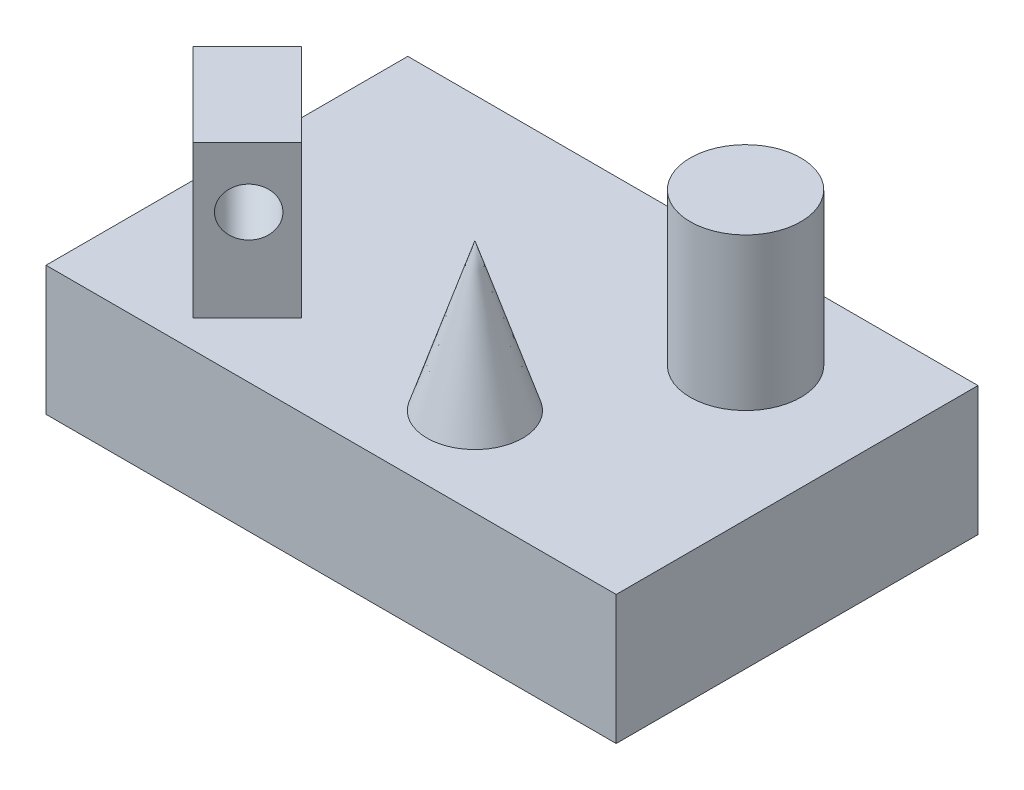
ISO-10303-21;
HEADER;
FILE_DESCRIPTION(('STEP AP214'),'2;1');
FILE_NAME('part.step','',(''),(''),'','','');
FILE_SCHEMA(('AUTOMOTIVE_DESIGN { 1 0 10303 214 1 1 1 1 }'));
ENDSEC;
DATA;
#1=APPLICATION_CONTEXT('core data for automotive mechanical design processes');
#2=APPLICATION_PROTOCOL_DEFINITION('international standard','automotive_design',2000,#1);
#3=PRODUCT_CONTEXT('',#1,'mechanical');
#4=PRODUCT('Part','Part','',(#3));
#5=PRODUCT_RELATED_PRODUCT_CATEGORY('part','',(#4));
#6=PRODUCT_DEFINITION_FORMATION('','',#4);
#7=PRODUCT_DEFINITION_CONTEXT('part definition',#1,'design');
#8=PRODUCT_DEFINITION('design','',#6,#7);
#9=PRODUCT_DEFINITION_SHAPE('','',#8);
#10=(LENGTH_UNIT() NAMED_UNIT(*) SI_UNIT(.MILLI.,.METRE.));
#11=(NAMED_UNIT(*) PLANE_ANGLE_UNIT() SI_UNIT($,.RADIAN.));
#12=(NAMED_UNIT(*) SI_UNIT($,.STERADIAN.) SOLID_ANGLE_UNIT());
#13=UNCERTAINTY_MEASURE_WITH_UNIT(LENGTH_MEASURE(1.E-05),#10,'distance_accuracy_value','');
#14=(GEOMETRIC_REPRESENTATION_CONTEXT(3) GLOBAL_UNCERTAINTY_ASSIGNED_CONTEXT((#13)) GLOBAL_UNIT_ASSIGNED_CONTEXT((#10,
#11,#12)) REPRESENTATION_CONTEXT('',''));
#15=CARTESIAN_POINT('',(0.,0.,0.));
#16=DIRECTION('',(0.,0.,1.));
#17=DIRECTION('',(1.,0.,0.));
#18=AXIS2_PLACEMENT_3D('',#15,#16,#17);
#19=CARTESIAN_POINT('',(33.5593300792751,12.7353157288854,-8.7390266420105));
#20=DIRECTION('',(0.,-1.,0.));
#21=DIRECTION('',(0.,0.,1.));
#22=AXIS2_PLACEMENT_3D('',#19,#20,#21);
#23=CONICAL_SURFACE('',#22,4.71714189217371,0.314159265358979);
#24=CARTESIAN_POINT('',(33.5593300792751,27.2531856729481,-8.7390266420105));
#25=VERTEX_POINT('',#24);
#26=VERTEX_LOOP('',#25);
#27=FACE_BOUND('',#26,.T.);
#28=CARTESIAN_POINT('',(33.5593300792751,12.7353157288854,-8.7390266420105));
#29=DIRECTION('',(0.,1.,0.));
#30=DIRECTION('',(0.,0.,1.));
#31=AXIS2_PLACEMENT_3D('',#28,#29,#30);
#32=CIRCLE('',#31,4.71714189217371);
#33=CARTESIAN_POINT('',(33.5593300792751,12.7353157288854,-4.02188474983679));
#34=VERTEX_POINT('',#33);
#35=EDGE_CURVE('E12',#34,#34,#32,.T.);
#36=ORIENTED_EDGE('',*,*,#35,.T.);
#37=EDGE_LOOP('',(#36));
#38=FACE_BOUND('',#37,.T.);
#39=ADVANCED_FACE('F48',(#27,#38),#23,.T.);
#40=CARTESIAN_POINT('',(33.5593300792751,12.7353157288854,-8.7390266420105));
#41=DIRECTION('',(0.,1.,0.));
#42=DIRECTION('',(0.,0.,1.));
#43=AXIS2_PLACEMENT_3D('',#40,#41,#42);
#44=PLANE('',#43);
#45=ORIENTED_EDGE('',*,*,#35,.F.);
#46=EDGE_LOOP('',(#45));
#47=FACE_BOUND('',#46,.T.);
#48=ADVANCED_FACE('F57',(#47),#44,.F.);
#49=CLOSED_SHELL('',(#39,#48));
#50=MANIFOLD_SOLID_BREP('B2',#49);
#51=CARTESIAN_POINT('',(43.0515985534843,27.7353157288854,-25.9367836423426));
#52=DIRECTION('',(0.,-1.,0.));
#53=DIRECTION('',(0.,0.,-1.));
#54=AXIS2_PLACEMENT_3D('',#51,#52,#53);
#55=CYLINDRICAL_SURFACE('',#54,5.45375066617644);
#56=CARTESIAN_POINT('',(43.0515985534843,27.7353157288854,-25.9367836423426));
#57=DIRECTION('',(0.,1.,0.));
#58=DIRECTION('',(0.,0.,1.));
#59=AXIS2_PLACEMENT_3D('',#56,#57,#58);
#60=CIRCLE('',#59,5.45375066617644);
#61=CARTESIAN_POINT('',(43.0515985534843,27.7353157288854,-20.4830329761661));
#62=VERTEX_POINT('',#61);
#63=EDGE_CURVE('E47',#62,#62,#60,.T.);
#64=ORIENTED_EDGE('',*,*,#63,.F.);
#65=EDGE_LOOP('',(#64));
#66=FACE_BOUND('',#65,.T.);
#67=CARTESIAN_POINT('',(43.0515985534843,12.7353157288854,-25.9367836423426));
#68=DIRECTION('',(0.,1.,0.));
#69=DIRECTION('',(0.,0.,1.));
#70=AXIS2_PLACEMENT_3D('',#67,#68,#69);
#71=CIRCLE('',#70,5.45375066617644);
#72=CARTESIAN_POINT('',(43.0515985534843,12.7353157288854,-20.4830329761661));
#73=VERTEX_POINT('',#72);
#74=EDGE_CURVE('E89',#73,#73,#71,.T.);
#75=ORIENTED_EDGE('',*,*,#74,.T.);
#76=EDGE_LOOP('',(#75));
#77=FACE_BOUND('',#76,.T.);
#78=ADVANCED_FACE('F86',(#66,#77),#55,.T.);
#79=CARTESIAN_POINT('',(43.0515985534843,27.7353157288854,-25.9367836423426));
#80=DIRECTION('',(0.,1.,0.));
#81=DIRECTION('',(0.,0.,1.));
#82=AXIS2_PLACEMENT_3D('',#79,#80,#81);
#83=PLANE('',#82);
#84=ORIENTED_EDGE('',*,*,#63,.T.);
#85=EDGE_LOOP('',(#84));
#86=FACE_BOUND('',#85,.T.);
#87=ADVANCED_FACE('F101',(#86),#83,.T.);
#88=CARTESIAN_POINT('',(43.0515985534843,12.7353157288854,-25.9367836423426));
#89=DIRECTION('',(0.,1.,0.));
#90=DIRECTION('',(0.,0.,1.));
#91=AXIS2_PLACEMENT_3D('',#88,#89,#90);
#92=PLANE('',#91);
#93=ORIENTED_EDGE('',*,*,#74,.F.);
#94=EDGE_LOOP('',(#93));
#95=FACE_BOUND('',#94,.T.);
#96=ADVANCED_FACE('F99',(#95),#92,.F.);
#97=CLOSED_SHELL('',(#78,#87,#96));
#98=MANIFOLD_SOLID_BREP('B6',#97);
#99=CARTESIAN_POINT('',(11.7593853706369,27.7353157288854,-2.75530498030886));
#100=DIRECTION('',(0.707106781186546,0.,-0.707106781186549));
#101=DIRECTION('',(-0.707106781186549,0.,-0.707106781186546));
#102=AXIS2_PLACEMENT_3D('',#99,#100,#101);
#103=PLANE('',#102);
#104=DIRECTION('',(0.707106781186549,0.,0.707106781186546));
#105=VECTOR('',#104,1.);
#106=CARTESIAN_POINT('',(11.7593853706369,12.7353157288854,-2.75530498030886));
#107=LINE('',#106,#105);
#108=CARTESIAN_POINT('',(3.57256399058611,12.7353157288854,-10.9421263603596));
#109=VERTEX_POINT('',#108);
#110=CARTESIAN_POINT('',(11.7593853706369,12.7353157288854,-2.75530498030886));
#111=VERTEX_POINT('',#110);
#112=EDGE_CURVE('E201',#109,#111,#107,.T.);
#113=ORIENTED_EDGE('',*,*,#112,.T.);
#114=DIRECTION('',(0.,-1.,0.));
#115=VECTOR('',#114,1.);
#116=CARTESIAN_POINT('',(11.7593853706369,27.7353157288854,-2.75530498030886));
#117=LINE('',#116,#115);
#118=CARTESIAN_POINT('',(11.7593853706369,27.7353157288854,-2.75530498030886));
#119=VERTEX_POINT('',#118);
#120=EDGE_CURVE('E84',#119,#111,#117,.T.);
#121=ORIENTED_EDGE('',*,*,#120,.F.);
#122=DIRECTION('',(0.707106781186549,0.,0.707106781186546));
#123=VECTOR('',#122,1.);
#124=CARTESIAN_POINT('',(11.7593853706369,27.7353157288854,-2.75530498030886));
#125=LINE('',#124,#123);
#126=CARTESIAN_POINT('',(3.57256399058611,27.7353157288854,-10.9421263603596));
#127=VERTEX_POINT('',#126);
#128=EDGE_CURVE('E188',#127,#119,#125,.T.);
#129=ORIENTED_EDGE('',*,*,#128,.F.);
#130=DIRECTION('',(0.,-1.,0.));
#131=VECTOR('',#130,1.);
#132=CARTESIAN_POINT('',(3.57256399058611,27.7353157288854,-10.9421263603596));
#133=LINE('',#132,#131);
#134=EDGE_CURVE('E197',#127,#109,#133,.T.);
#135=ORIENTED_EDGE('',*,*,#134,.T.);
#136=EDGE_LOOP('',(#113,#121,#129,#135));
#137=FACE_BOUND('',#136,.T.);
#138=ADVANCED_FACE('F136',(#137),#103,.F.);
#139=CARTESIAN_POINT('',(17.1091894407691,27.7353157288854,-8.10510905044106));
#140=DIRECTION('',(-0.707106781186549,0.,-0.707106781186546));
#141=DIRECTION('',(-0.707106781186546,0.,0.707106781186549));
#142=AXIS2_PLACEMENT_3D('',#139,#140,#141);
#143=PLANE('',#142);
#144=CARTESIAN_POINT('',(14.4970043060488,21.7763026803264,-5.49292391572073));
#145=DIRECTION('',(-0.707106781186549,0.,-0.707106781186546));
#146=DIRECTION('',(-0.707106781186546,0.,0.707106781186549));
#147=AXIS2_PLACEMENT_3D('',#144,#145,#146);
#148=CIRCLE('',#147,2.3887119439335);
#149=CARTESIAN_POINT('',(12.8079298921921,21.7763026803264,-3.80384950186405));
#150=VERTEX_POINT('',#149);
#151=EDGE_CURVE('E204',#150,#150,#148,.T.);
#152=ORIENTED_EDGE('',*,*,#151,.T.);
#153=EDGE_LOOP('',(#152));
#154=FACE_BOUND('',#153,.T.);
#155=DIRECTION('',(0.707106781186546,0.,-0.707106781186549));
#156=VECTOR('',#155,1.);
#157=CARTESIAN_POINT('',(17.1091894407691,12.7353157288854,-8.10510905044106));
#158=LINE('',#157,#156);
#159=CARTESIAN_POINT('',(17.1091894407691,12.7353157288854,-8.10510905044106));
#160=VERTEX_POINT('',#159);
#161=EDGE_CURVE('E192',#111,#160,#158,.T.);
#162=ORIENTED_EDGE('',*,*,#161,.T.);
#163=DIRECTION('',(0.,-1.,0.));
#164=VECTOR('',#163,1.);
#165=CARTESIAN_POINT('',(17.1091894407691,27.7353157288854,-8.10510905044106));
#166=LINE('',#165,#164);
#167=CARTESIAN_POINT('',(17.1091894407691,27.7353157288854,-8.10510905044106));
#168=VERTEX_POINT('',#167);
#169=EDGE_CURVE('E145',#168,#160,#166,.T.);
#170=ORIENTED_EDGE('',*,*,#169,.F.);
#171=DIRECTION('',(0.707106781186546,0.,-0.707106781186549));
#172=VECTOR('',#171,1.);
#173=CARTESIAN_POINT('',(17.1091894407691,27.7353157288854,-8.10510905044106));
#174=LINE('',#173,#172);
#175=EDGE_CURVE('E183',#119,#168,#174,.T.);
#176=ORIENTED_EDGE('',*,*,#175,.F.);
#177=ORIENTED_EDGE('',*,*,#120,.T.);
#178=EDGE_LOOP('',(#162,#170,#176,#177));
#179=FACE_BOUND('',#178,.T.);
#180=ADVANCED_FACE('F191',(#154,#179),#143,.F.);
#181=CARTESIAN_POINT('',(8.9223680607183,27.7353157288854,-16.2919304304918));
#182=DIRECTION('',(-0.707106781186546,0.,0.707106781186549));
#183=DIRECTION('',(0.707106781186549,0.,0.707106781186546));
#184=AXIS2_PLACEMENT_3D('',#181,#182,#183);
#185=PLANE('',#184);
#186=DIRECTION('',(-0.707106781186549,0.,-0.707106781186546));
#187=VECTOR('',#186,1.);
#188=CARTESIAN_POINT('',(8.9223680607183,12.7353157288854,-16.2919304304918));
#189=LINE('',#188,#187);
#190=CARTESIAN_POINT('',(8.9223680607183,12.7353157288854,-16.2919304304918));
#191=VERTEX_POINT('',#190);
#192=EDGE_CURVE('E170',#160,#191,#189,.T.);
#193=ORIENTED_EDGE('',*,*,#192,.T.);
#194=DIRECTION('',(0.,-1.,0.));
#195=VECTOR('',#194,1.);
#196=CARTESIAN_POINT('',(8.9223680607183,27.7353157288854,-16.2919304304918));
#197=LINE('',#196,#195);
#198=CARTESIAN_POINT('',(8.9223680607183,27.7353157288854,-16.2919304304918));
#199=VERTEX_POINT('',#198);
#200=EDGE_CURVE('E193',#199,#191,#197,.T.);
#201=ORIENTED_EDGE('',*,*,#200,.F.);
#202=DIRECTION('',(-0.707106781186549,0.,-0.707106781186546));
#203=VECTOR('',#202,1.);
#204=CARTESIAN_POINT('',(8.9223680607183,27.7353157288854,-16.2919304304918));
#205=LINE('',#204,#203);
#206=EDGE_CURVE('E186',#168,#199,#205,.T.);
#207=ORIENTED_EDGE('',*,*,#206,.F.);
#208=ORIENTED_EDGE('',*,*,#169,.T.);
#209=EDGE_LOOP('',(#193,#201,#207,#208));
#210=FACE_BOUND('',#209,.T.);
#211=ADVANCED_FACE('F195',(#210),#185,.F.);
#212=CARTESIAN_POINT('',(3.57256399058611,27.7353157288854,-10.9421263603596));
#213=DIRECTION('',(0.707106781186549,0.,0.707106781186546));
#214=DIRECTION('',(0.707106781186546,0.,-0.707106781186549));
#215=AXIS2_PLACEMENT_3D('',#212,#213,#214);
#216=PLANE('',#215);
#217=CARTESIAN_POINT('',(6.31018292599797,21.7763026803264,-13.6797452957715));
#218=DIRECTION('',(0.707106781186549,0.,0.707106781186546));
#219=DIRECTION('',(0.707106781186546,0.,-0.707106781186549));
#220=AXIS2_PLACEMENT_3D('',#217,#218,#219);
#221=CIRCLE('',#220,2.3887119439335);
#222=CARTESIAN_POINT('',(7.99925733985464,21.7763026803264,-15.3688197096282));
#223=VERTEX_POINT('',#222);
#224=EDGE_CURVE('E139',#223,#223,#221,.T.);
#225=ORIENTED_EDGE('',*,*,#224,.T.);
#226=EDGE_LOOP('',(#225));
#227=FACE_BOUND('',#226,.T.);
#228=DIRECTION('',(-0.707106781186546,0.,0.707106781186549));
#229=VECTOR('',#228,1.);
#230=CARTESIAN_POINT('',(3.57256399058611,12.7353157288854,-10.9421263603596));
#231=LINE('',#230,#229);
#232=EDGE_CURVE('E176',#191,#109,#231,.T.);
#233=ORIENTED_EDGE('',*,*,#232,.T.);
#234=ORIENTED_EDGE('',*,*,#134,.F.);
#235=DIRECTION('',(-0.707106781186546,0.,0.707106781186549));
#236=VECTOR('',#235,1.);
#237=CARTESIAN_POINT('',(3.57256399058611,27.7353157288854,-10.9421263603596));
#238=LINE('',#237,#236);
#239=EDGE_CURVE('E153',#199,#127,#238,.T.);
#240=ORIENTED_EDGE('',*,*,#239,.F.);
#241=ORIENTED_EDGE('',*,*,#200,.T.);
#242=EDGE_LOOP('',(#233,#234,#240,#241));
#243=FACE_BOUND('',#242,.T.);
#244=ADVANCED_FACE('F209',(#227,#243),#216,.F.);
#245=CARTESIAN_POINT('',(0.,27.7353157288854,0.));
#246=DIRECTION('',(0.,-1.,0.));
#247=DIRECTION('',(0.,0.,-1.));
#248=AXIS2_PLACEMENT_3D('',#245,#246,#247);
#249=PLANE('',#248);
#250=ORIENTED_EDGE('',*,*,#128,.T.);
#251=ORIENTED_EDGE('',*,*,#175,.T.);
#252=ORIENTED_EDGE('',*,*,#206,.T.);
#253=ORIENTED_EDGE('',*,*,#239,.T.);
#254=EDGE_LOOP('',(#250,#251,#252,#253));
#255=FACE_BOUND('',#254,.T.);
#256=ADVANCED_FACE('F184',(#255),#249,.F.);
#257=CARTESIAN_POINT('',(0.,12.7353157288854,0.));
#258=DIRECTION('',(0.,-1.,0.));
#259=DIRECTION('',(0.,0.,-1.));
#260=AXIS2_PLACEMENT_3D('',#257,#258,#259);
#261=PLANE('',#260);
#262=ORIENTED_EDGE('',*,*,#112,.F.);
#263=ORIENTED_EDGE('',*,*,#232,.F.);
#264=ORIENTED_EDGE('',*,*,#192,.F.);
#265=ORIENTED_EDGE('',*,*,#161,.F.);
#266=EDGE_LOOP('',(#262,#263,#264,#265));
#267=FACE_BOUND('',#266,.T.);
#268=ADVANCED_FACE('F212',(#267),#261,.T.);
#269=CARTESIAN_POINT('',(-7.84547289169112,21.7763026803264,-27.8354011134606));
#270=DIRECTION('',(0.707106781186549,0.,0.707106781186546));
#271=DIRECTION('',(0.707106781186546,0.,-0.707106781186549));
#272=AXIS2_PLACEMENT_3D('',#269,#270,#271);
#273=CYLINDRICAL_SURFACE('',#272,2.3887119439335);
#274=ORIENTED_EDGE('',*,*,#224,.F.);
#275=EDGE_LOOP('',(#274));
#276=FACE_BOUND('',#275,.T.);
#277=ORIENTED_EDGE('',*,*,#151,.F.);
#278=EDGE_LOOP('',(#277));
#279=FACE_BOUND('',#278,.T.);
#280=ADVANCED_FACE('F222',(#276,#279),#273,.F.);
#281=CLOSED_SHELL('',(#138,#180,#211,#244,#256,#268,#280));
#282=MANIFOLD_SOLID_BREP('B42',#281);
#283=CARTESIAN_POINT('',(0.,12.7353157288854,0.));
#284=DIRECTION('',(1.,0.,0.));
#285=DIRECTION('',(0.,0.,-1.));
#286=AXIS2_PLACEMENT_3D('',#283,#284,#285);
#287=PLANE('',#286);
#288=DIRECTION('',(0.,0.,1.));
#289=VECTOR('',#288,1.);
#290=CARTESIAN_POINT('',(0.,0.,0.));
#291=LINE('',#290,#289);
#292=CARTESIAN_POINT('',(0.,0.,-35.6808740051517));
#293=VERTEX_POINT('',#292);
#294=CARTESIAN_POINT('',(0.,0.,0.));
#295=VERTEX_POINT('',#294);
#296=EDGE_CURVE('E344',#293,#295,#291,.T.);
#297=ORIENTED_EDGE('',*,*,#296,.T.);
#298=DIRECTION('',(0.,-1.,0.));
#299=VECTOR('',#298,1.);
#300=CARTESIAN_POINT('',(0.,12.7353157288854,0.));
#301=LINE('',#300,#299);
#302=CARTESIAN_POINT('',(0.,12.7353157288854,0.));
#303=VERTEX_POINT('',#302);
#304=EDGE_CURVE('E134',#303,#295,#301,.T.);
#305=ORIENTED_EDGE('',*,*,#304,.F.);
#306=DIRECTION('',(0.,0.,1.));
#307=VECTOR('',#306,1.);
#308=CARTESIAN_POINT('',(0.,12.7353157288854,0.));
#309=LINE('',#308,#307);
#310=CARTESIAN_POINT('',(0.,12.7353157288854,-35.6808740051517));
#311=VERTEX_POINT('',#310);
#312=EDGE_CURVE('E332',#311,#303,#309,.T.);
#313=ORIENTED_EDGE('',*,*,#312,.F.);
#314=DIRECTION('',(0.,-1.,0.));
#315=VECTOR('',#314,1.);
#316=CARTESIAN_POINT('',(0.,12.7353157288854,-35.6808740051517));
#317=LINE('',#316,#315);
#318=EDGE_CURVE('E340',#311,#293,#317,.T.);
#319=ORIENTED_EDGE('',*,*,#318,.T.);
#320=EDGE_LOOP('',(#297,#305,#313,#319));
#321=FACE_BOUND('',#320,.T.);
#322=ADVANCED_FACE('F281',(#321),#287,.F.);
#323=CARTESIAN_POINT('',(0.,12.7353157288854,0.));
#324=DIRECTION('',(0.,0.,-1.));
#325=DIRECTION('',(-1.,0.,0.));
#326=AXIS2_PLACEMENT_3D('',#323,#324,#325);
#327=PLANE('',#326);
#328=DIRECTION('',(1.,0.,0.));
#329=VECTOR('',#328,1.);
#330=CARTESIAN_POINT('',(0.,0.,0.));
#331=LINE('',#330,#329);
#332=CARTESIAN_POINT('',(56.2304698498983,0.,0.));
#333=VERTEX_POINT('',#332);
#334=EDGE_CURVE('E336',#295,#333,#331,.T.);
#335=ORIENTED_EDGE('',*,*,#334,.T.);
#336=DIRECTION('',(0.,-1.,0.));
#337=VECTOR('',#336,1.);
#338=CARTESIAN_POINT('',(56.2304698498983,12.7353157288854,0.));
#339=LINE('',#338,#337);
#340=CARTESIAN_POINT('',(56.2304698498983,12.7353157288854,0.));
#341=VERTEX_POINT('',#340);
#342=EDGE_CURVE('E289',#341,#333,#339,.T.);
#343=ORIENTED_EDGE('',*,*,#342,.F.);
#344=DIRECTION('',(1.,0.,0.));
#345=VECTOR('',#344,1.);
#346=CARTESIAN_POINT('',(0.,12.7353157288854,0.));
#347=LINE('',#346,#345);
#348=EDGE_CURVE('E327',#303,#341,#347,.T.);
#349=ORIENTED_EDGE('',*,*,#348,.F.);
#350=ORIENTED_EDGE('',*,*,#304,.T.);
#351=EDGE_LOOP('',(#335,#343,#349,#350));
#352=FACE_BOUND('',#351,.T.);
#353=ADVANCED_FACE('F335',(#352),#327,.F.);
#354=CARTESIAN_POINT('',(56.2304698498983,12.7353157288854,0.));
#355=DIRECTION('',(-1.,0.,0.));
#356=DIRECTION('',(0.,0.,1.));
#357=AXIS2_PLACEMENT_3D('',#354,#355,#356);
#358=PLANE('',#357);
#359=DIRECTION('',(0.,0.,-1.));
#360=VECTOR('',#359,1.);
#361=CARTESIAN_POINT('',(56.2304698498983,0.,0.));
#362=LINE('',#361,#360);
#363=CARTESIAN_POINT('',(56.2304698498983,0.,-35.6808740051517));
#364=VERTEX_POINT('',#363);
#365=EDGE_CURVE('E314',#333,#364,#362,.T.);
#366=ORIENTED_EDGE('',*,*,#365,.T.);
#367=DIRECTION('',(0.,-1.,0.));
#368=VECTOR('',#367,1.);
#369=CARTESIAN_POINT('',(56.2304698498983,12.7353157288854,-35.6808740051517));
#370=LINE('',#369,#368);
#371=CARTESIAN_POINT('',(56.2304698498983,12.7353157288854,-35.6808740051517));
#372=VERTEX_POINT('',#371);
#373=EDGE_CURVE('E337',#372,#364,#370,.T.);
#374=ORIENTED_EDGE('',*,*,#373,.F.);
#375=DIRECTION('',(0.,0.,-1.));
#376=VECTOR('',#375,1.);
#377=CARTESIAN_POINT('',(56.2304698498983,12.7353157288854,0.));
#378=LINE('',#377,#376);
#379=EDGE_CURVE('E330',#341,#372,#378,.T.);
#380=ORIENTED_EDGE('',*,*,#379,.F.);
#381=ORIENTED_EDGE('',*,*,#342,.T.);
#382=EDGE_LOOP('',(#366,#374,#380,#381));
#383=FACE_BOUND('',#382,.T.);
#384=ADVANCED_FACE('F338',(#383),#358,.F.);
#385=CARTESIAN_POINT('',(0.,12.7353157288854,-35.6808740051517));
#386=DIRECTION('',(0.,0.,1.));
#387=DIRECTION('',(1.,0.,0.));
#388=AXIS2_PLACEMENT_3D('',#385,#386,#387);
#389=PLANE('',#388);
#390=DIRECTION('',(-1.,0.,0.));
#391=VECTOR('',#390,1.);
#392=CARTESIAN_POINT('',(0.,0.,-35.6808740051517));
#393=LINE('',#392,#391);
#394=EDGE_CURVE('E320',#364,#293,#393,.T.);
#395=ORIENTED_EDGE('',*,*,#394,.T.);
#396=ORIENTED_EDGE('',*,*,#318,.F.);
#397=DIRECTION('',(-1.,0.,0.));
#398=VECTOR('',#397,1.);
#399=CARTESIAN_POINT('',(0.,12.7353157288854,-35.6808740051517));
#400=LINE('',#399,#398);
#401=EDGE_CURVE('E297',#372,#311,#400,.T.);
#402=ORIENTED_EDGE('',*,*,#401,.F.);
#403=ORIENTED_EDGE('',*,*,#373,.T.);
#404=EDGE_LOOP('',(#395,#396,#402,#403));
#405=FACE_BOUND('',#404,.T.);
#406=ADVANCED_FACE('F351',(#405),#389,.F.);
#407=CARTESIAN_POINT('',(0.,12.7353157288854,0.));
#408=DIRECTION('',(0.,-1.,0.));
#409=DIRECTION('',(0.,0.,-1.));
#410=AXIS2_PLACEMENT_3D('',#407,#408,#409);
#411=PLANE('',#410);
#412=ORIENTED_EDGE('',*,*,#312,.T.);
#413=ORIENTED_EDGE('',*,*,#348,.T.);
#414=ORIENTED_EDGE('',*,*,#379,.T.);
#415=ORIENTED_EDGE('',*,*,#401,.T.);
#416=EDGE_LOOP('',(#412,#413,#414,#415));
#417=FACE_BOUND('',#416,.T.);
#418=ADVANCED_FACE('F328',(#417),#411,.F.);
#419=CARTESIAN_POINT('',(0.,0.,0.));
#420=DIRECTION('',(0.,-1.,0.));
#421=DIRECTION('',(0.,0.,-1.));
#422=AXIS2_PLACEMENT_3D('',#419,#420,#421);
#423=PLANE('',#422);
#424=ORIENTED_EDGE('',*,*,#296,.F.);
#425=ORIENTED_EDGE('',*,*,#394,.F.);
#426=ORIENTED_EDGE('',*,*,#365,.F.);
#427=ORIENTED_EDGE('',*,*,#334,.F.);
#428=EDGE_LOOP('',(#424,#425,#426,#427));
#429=FACE_BOUND('',#428,.T.);
#430=ADVANCED_FACE('F354',(#429),#423,.T.);
#431=CLOSED_SHELL('',(#322,#353,#384,#406,#418,#430));
#432=MANIFOLD_SOLID_BREP('B78',#431);
#433=ADVANCED_BREP_SHAPE_REPRESENTATION('',(#18,#50,#98,#282,#432),#14);
#434=SHAPE_DEFINITION_REPRESENTATION(#9,#433);
ENDSEC;
END-ISO-10303-21;
